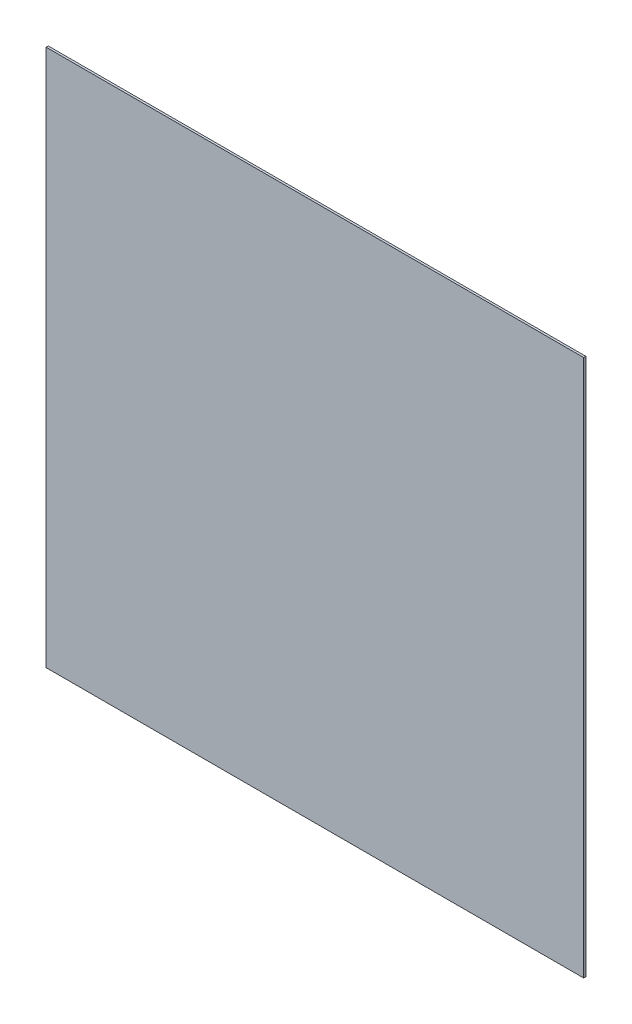
ISO-10303-21;
HEADER;
FILE_DESCRIPTION(('STEP AP214'),'2;1');
FILE_NAME('part.step','',(''),(''),'','','');
FILE_SCHEMA(('AUTOMOTIVE_DESIGN { 1 0 10303 214 1 1 1 1 }'));
ENDSEC;
DATA;
#1=APPLICATION_CONTEXT('core data for automotive mechanical design processes');
#2=APPLICATION_PROTOCOL_DEFINITION('international standard','automotive_design',2000,#1);
#3=PRODUCT_CONTEXT('',#1,'mechanical');
#4=PRODUCT('Part','Part','',(#3));
#5=PRODUCT_RELATED_PRODUCT_CATEGORY('part','',(#4));
#6=PRODUCT_DEFINITION_FORMATION('','',#4);
#7=PRODUCT_DEFINITION_CONTEXT('part definition',#1,'design');
#8=PRODUCT_DEFINITION('design','',#6,#7);
#9=PRODUCT_DEFINITION_SHAPE('','',#8);
#10=(LENGTH_UNIT() NAMED_UNIT(*) SI_UNIT(.MILLI.,.METRE.));
#11=(NAMED_UNIT(*) PLANE_ANGLE_UNIT() SI_UNIT($,.RADIAN.));
#12=(NAMED_UNIT(*) SI_UNIT($,.STERADIAN.) SOLID_ANGLE_UNIT());
#13=UNCERTAINTY_MEASURE_WITH_UNIT(LENGTH_MEASURE(1.E-05),#10,'distance_accuracy_value','');
#14=(GEOMETRIC_REPRESENTATION_CONTEXT(3) GLOBAL_UNCERTAINTY_ASSIGNED_CONTEXT((#13)) GLOBAL_UNIT_ASSIGNED_CONTEXT((#10,
#11,#12)) REPRESENTATION_CONTEXT('',''));
#15=CARTESIAN_POINT('',(0.,0.,0.));
#16=DIRECTION('',(0.,0.,1.));
#17=DIRECTION('',(1.,0.,0.));
#18=AXIS2_PLACEMENT_3D('',#15,#16,#17);
#19=CARTESIAN_POINT('',(500.,4.00000000000009,4.));
#20=DIRECTION('',(-1.,0.,0.));
#21=DIRECTION('',(0.,-1.,0.));
#22=AXIS2_PLACEMENT_3D('',#19,#20,#21);
#23=PLANE('',#22);
#24=DIRECTION('',(0.,1.,0.));
#25=VECTOR('',#24,1.);
#26=CARTESIAN_POINT('',(500.,4.00000000000009,0.));
#27=LINE('',#26,#25);
#28=CARTESIAN_POINT('',(500.,-996.,0.));
#29=VERTEX_POINT('',#28);
#30=CARTESIAN_POINT('',(500.,4.00000000000009,0.));
#31=VERTEX_POINT('',#30);
#32=EDGE_CURVE('E102',#29,#31,#27,.T.);
#33=ORIENTED_EDGE('',*,*,#32,.T.);
#34=DIRECTION('',(0.,0.,-1.));
#35=VECTOR('',#34,1.);
#36=CARTESIAN_POINT('',(500.,4.00000000000009,4.));
#37=LINE('',#36,#35);
#38=CARTESIAN_POINT('',(500.,4.00000000000009,4.));
#39=VERTEX_POINT('',#38);
#40=EDGE_CURVE('E11',#39,#31,#37,.T.);
#41=ORIENTED_EDGE('',*,*,#40,.F.);
#42=DIRECTION('',(0.,1.,0.));
#43=VECTOR('',#42,1.);
#44=CARTESIAN_POINT('',(500.,4.00000000000009,4.));
#45=LINE('',#44,#43);
#46=CARTESIAN_POINT('',(500.,-996.,4.));
#47=VERTEX_POINT('',#46);
#48=EDGE_CURVE('E90',#47,#39,#45,.T.);
#49=ORIENTED_EDGE('',*,*,#48,.F.);
#50=DIRECTION('',(0.,0.,-1.));
#51=VECTOR('',#50,1.);
#52=CARTESIAN_POINT('',(500.,-996.,4.));
#53=LINE('',#52,#51);
#54=EDGE_CURVE('E98',#47,#29,#53,.T.);
#55=ORIENTED_EDGE('',*,*,#54,.T.);
#56=EDGE_LOOP('',(#33,#41,#49,#55));
#57=FACE_BOUND('',#56,.T.);
#58=ADVANCED_FACE('F39',(#57),#23,.F.);
#59=CARTESIAN_POINT('',(500.,4.00000000000009,4.));
#60=DIRECTION('',(0.,-1.,0.));
#61=DIRECTION('',(1.,0.,0.));
#62=AXIS2_PLACEMENT_3D('',#59,#60,#61);
#63=PLANE('',#62);
#64=DIRECTION('',(-1.,0.,0.));
#65=VECTOR('',#64,1.);
#66=CARTESIAN_POINT('',(500.,4.00000000000009,0.));
#67=LINE('',#66,#65);
#68=CARTESIAN_POINT('',(-500.,3.99999999999997,0.));
#69=VERTEX_POINT('',#68);
#70=EDGE_CURVE('E94',#31,#69,#67,.T.);
#71=ORIENTED_EDGE('',*,*,#70,.T.);
#72=DIRECTION('',(0.,0.,-1.));
#73=VECTOR('',#72,1.);
#74=CARTESIAN_POINT('',(-500.,3.99999999999997,4.));
#75=LINE('',#74,#73);
#76=CARTESIAN_POINT('',(-500.,3.99999999999997,4.));
#77=VERTEX_POINT('',#76);
#78=EDGE_CURVE('E47',#77,#69,#75,.T.);
#79=ORIENTED_EDGE('',*,*,#78,.F.);
#80=DIRECTION('',(-1.,0.,0.));
#81=VECTOR('',#80,1.);
#82=CARTESIAN_POINT('',(500.,4.00000000000009,4.));
#83=LINE('',#82,#81);
#84=EDGE_CURVE('E85',#39,#77,#83,.T.);
#85=ORIENTED_EDGE('',*,*,#84,.F.);
#86=ORIENTED_EDGE('',*,*,#40,.T.);
#87=EDGE_LOOP('',(#71,#79,#85,#86));
#88=FACE_BOUND('',#87,.T.);
#89=ADVANCED_FACE('F93',(#88),#63,.F.);
#90=CARTESIAN_POINT('',(-500.,3.99999999999997,4.));
#91=DIRECTION('',(1.,0.,0.));
#92=DIRECTION('',(0.,0.,-1.));
#93=AXIS2_PLACEMENT_3D('',#90,#91,#92);
#94=PLANE('',#93);
#95=DIRECTION('',(0.,-1.,0.));
#96=VECTOR('',#95,1.);
#97=CARTESIAN_POINT('',(-500.,3.99999999999997,0.));
#98=LINE('',#97,#96);
#99=CARTESIAN_POINT('',(-500.,-996.,0.));
#100=VERTEX_POINT('',#99);
#101=EDGE_CURVE('E72',#69,#100,#98,.T.);
#102=ORIENTED_EDGE('',*,*,#101,.T.);
#103=DIRECTION('',(0.,0.,-1.));
#104=VECTOR('',#103,1.);
#105=CARTESIAN_POINT('',(-500.,-996.,4.));
#106=LINE('',#105,#104);
#107=CARTESIAN_POINT('',(-500.,-996.,4.));
#108=VERTEX_POINT('',#107);
#109=EDGE_CURVE('E95',#108,#100,#106,.T.);
#110=ORIENTED_EDGE('',*,*,#109,.F.);
#111=DIRECTION('',(0.,-1.,0.));
#112=VECTOR('',#111,1.);
#113=CARTESIAN_POINT('',(-500.,3.99999999999997,4.));
#114=LINE('',#113,#112);
#115=EDGE_CURVE('E88',#77,#108,#114,.T.);
#116=ORIENTED_EDGE('',*,*,#115,.F.);
#117=ORIENTED_EDGE('',*,*,#78,.T.);
#118=EDGE_LOOP('',(#102,#110,#116,#117));
#119=FACE_BOUND('',#118,.T.);
#120=ADVANCED_FACE('F96',(#119),#94,.F.);
#121=CARTESIAN_POINT('',(500.,-996.,4.));
#122=DIRECTION('',(0.,1.,0.));
#123=DIRECTION('',(-1.,0.,0.));
#124=AXIS2_PLACEMENT_3D('',#121,#122,#123);
#125=PLANE('',#124);
#126=DIRECTION('',(1.,0.,0.));
#127=VECTOR('',#126,1.);
#128=CARTESIAN_POINT('',(500.,-996.,0.));
#129=LINE('',#128,#127);
#130=EDGE_CURVE('E78',#100,#29,#129,.T.);
#131=ORIENTED_EDGE('',*,*,#130,.T.);
#132=ORIENTED_EDGE('',*,*,#54,.F.);
#133=DIRECTION('',(1.,0.,0.));
#134=VECTOR('',#133,1.);
#135=CARTESIAN_POINT('',(500.,-996.,4.));
#136=LINE('',#135,#134);
#137=EDGE_CURVE('E55',#108,#47,#136,.T.);
#138=ORIENTED_EDGE('',*,*,#137,.F.);
#139=ORIENTED_EDGE('',*,*,#109,.T.);
#140=EDGE_LOOP('',(#131,#132,#138,#139));
#141=FACE_BOUND('',#140,.T.);
#142=ADVANCED_FACE('F109',(#141),#125,.F.);
#143=CARTESIAN_POINT('',(0.,0.,4.));
#144=DIRECTION('',(0.,0.,-1.));
#145=DIRECTION('',(-1.,0.,0.));
#146=AXIS2_PLACEMENT_3D('',#143,#144,#145);
#147=PLANE('',#146);
#148=ORIENTED_EDGE('',*,*,#48,.T.);
#149=ORIENTED_EDGE('',*,*,#84,.T.);
#150=ORIENTED_EDGE('',*,*,#115,.T.);
#151=ORIENTED_EDGE('',*,*,#137,.T.);
#152=EDGE_LOOP('',(#148,#149,#150,#151));
#153=FACE_BOUND('',#152,.T.);
#154=ADVANCED_FACE('F86',(#153),#147,.F.);
#155=CARTESIAN_POINT('',(0.,0.,0.));
#156=DIRECTION('',(0.,0.,-1.));
#157=DIRECTION('',(-1.,0.,0.));
#158=AXIS2_PLACEMENT_3D('',#155,#156,#157);
#159=PLANE('',#158);
#160=ORIENTED_EDGE('',*,*,#32,.F.);
#161=ORIENTED_EDGE('',*,*,#130,.F.);
#162=ORIENTED_EDGE('',*,*,#101,.F.);
#163=ORIENTED_EDGE('',*,*,#70,.F.);
#164=EDGE_LOOP('',(#160,#161,#162,#163));
#165=FACE_BOUND('',#164,.T.);
#166=ADVANCED_FACE('F112',(#165),#159,.T.);
#167=CLOSED_SHELL('',(#58,#89,#120,#142,#154,#166));
#168=MANIFOLD_SOLID_BREP('B2',#167);
#169=ADVANCED_BREP_SHAPE_REPRESENTATION('',(#18,#168),#14);
#170=SHAPE_DEFINITION_REPRESENTATION(#9,#169);
ENDSEC;
END-ISO-10303-21;
